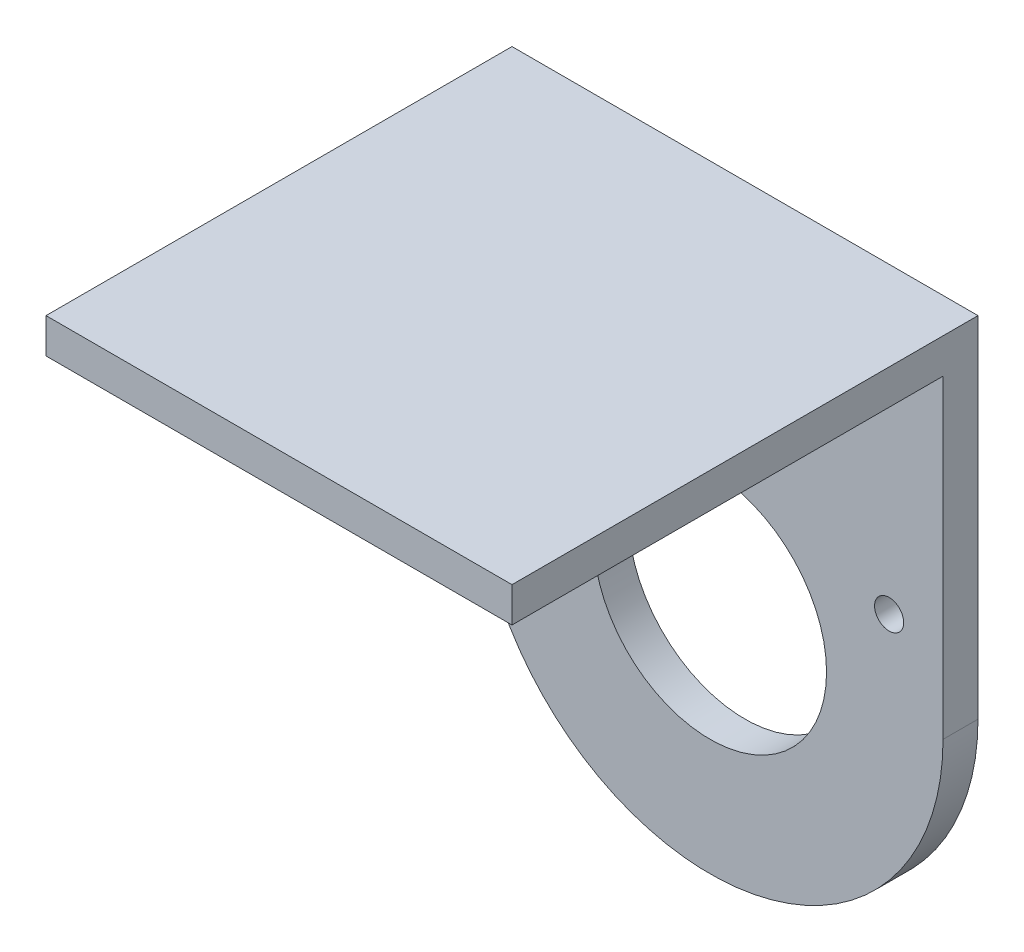
ISO-10303-21;
HEADER;
FILE_DESCRIPTION(('STEP AP214'),'2;1');
FILE_NAME('part.step','',(''),(''),'','','');
FILE_SCHEMA(('AUTOMOTIVE_DESIGN { 1 0 10303 214 1 1 1 1 }'));
ENDSEC;
DATA;
#1=APPLICATION_CONTEXT('core data for automotive mechanical design processes');
#2=APPLICATION_PROTOCOL_DEFINITION('international standard','automotive_design',2000,#1);
#3=PRODUCT_CONTEXT('',#1,'mechanical');
#4=PRODUCT('Part','Part','',(#3));
#5=PRODUCT_RELATED_PRODUCT_CATEGORY('part','',(#4));
#6=PRODUCT_DEFINITION_FORMATION('','',#4);
#7=PRODUCT_DEFINITION_CONTEXT('part definition',#1,'design');
#8=PRODUCT_DEFINITION('design','',#6,#7);
#9=PRODUCT_DEFINITION_SHAPE('','',#8);
#10=(LENGTH_UNIT() NAMED_UNIT(*) SI_UNIT(.MILLI.,.METRE.));
#11=(NAMED_UNIT(*) PLANE_ANGLE_UNIT() SI_UNIT($,.RADIAN.));
#12=(NAMED_UNIT(*) SI_UNIT($,.STERADIAN.) SOLID_ANGLE_UNIT());
#13=UNCERTAINTY_MEASURE_WITH_UNIT(LENGTH_MEASURE(1.E-05),#10,'distance_accuracy_value','');
#14=(GEOMETRIC_REPRESENTATION_CONTEXT(3) GLOBAL_UNCERTAINTY_ASSIGNED_CONTEXT((#13)) GLOBAL_UNIT_ASSIGNED_CONTEXT((#10,
#11,#12)) REPRESENTATION_CONTEXT('',''));
#15=CARTESIAN_POINT('',(0.,0.,0.));
#16=DIRECTION('',(0.,0.,1.));
#17=DIRECTION('',(1.,0.,0.));
#18=AXIS2_PLACEMENT_3D('',#15,#16,#17);
#19=CARTESIAN_POINT('',(2.4469741150185,-18.0472980486732,40.));
#20=DIRECTION('',(0.,0.,-1.));
#21=DIRECTION('',(-1.,0.,0.));
#22=AXIS2_PLACEMENT_3D('',#19,#20,#21);
#23=CYLINDRICAL_SURFACE('',#22,20.);
#24=CARTESIAN_POINT('',(2.4469741150185,-18.0472980486734,3.));
#25=DIRECTION('',(0.,0.,1.));
#26=DIRECTION('',(1.,0.,0.));
#27=AXIS2_PLACEMENT_3D('',#24,#25,#26);
#28=CIRCLE('',#27,20.);
#29=CARTESIAN_POINT('',(-17.5530258849815,-18.0472980486734,3.));
#30=VERTEX_POINT('',#29);
#31=CARTESIAN_POINT('',(22.4469741150185,-18.0472980486732,3.));
#32=VERTEX_POINT('',#31);
#33=EDGE_CURVE('E55',#30,#32,#28,.T.);
#34=ORIENTED_EDGE('',*,*,#33,.F.);
#35=DIRECTION('',(0.,0.,-1.));
#36=VECTOR('',#35,1.);
#37=CARTESIAN_POINT('',(-17.5530258849815,-18.0472980486732,40.));
#38=LINE('',#37,#36);
#39=CARTESIAN_POINT('',(-17.5530258849815,-18.0472980486732,0.));
#40=VERTEX_POINT('',#39);
#41=EDGE_CURVE('E11',#30,#40,#38,.T.);
#42=ORIENTED_EDGE('',*,*,#41,.T.);
#43=CARTESIAN_POINT('',(2.4469741150185,-18.0472980486732,0.));
#44=DIRECTION('',(0.,0.,1.));
#45=DIRECTION('',(1.,0.,0.));
#46=AXIS2_PLACEMENT_3D('',#43,#44,#45);
#47=CIRCLE('',#46,20.);
#48=CARTESIAN_POINT('',(22.4469741150185,-18.0472980486732,0.));
#49=VERTEX_POINT('',#48);
#50=EDGE_CURVE('E106',#40,#49,#47,.T.);
#51=ORIENTED_EDGE('',*,*,#50,.T.);
#52=DIRECTION('',(0.,0.,-1.));
#53=VECTOR('',#52,1.);
#54=CARTESIAN_POINT('',(22.4469741150185,-18.0472980486732,40.));
#55=LINE('',#54,#53);
#56=EDGE_CURVE('E48',#32,#49,#55,.T.);
#57=ORIENTED_EDGE('',*,*,#56,.F.);
#58=EDGE_LOOP('',(#34,#42,#51,#57));
#59=FACE_BOUND('',#58,.T.);
#60=ADVANCED_FACE('F39',(#59),#23,.T.);
#61=CARTESIAN_POINT('',(2.4469741150185,-18.0472980486732,40.));
#62=DIRECTION('',(0.,0.,-1.));
#63=DIRECTION('',(-1.,0.,0.));
#64=AXIS2_PLACEMENT_3D('',#61,#62,#63);
#65=CYLINDRICAL_SURFACE('',#64,10.);
#66=CARTESIAN_POINT('',(2.4469741150185,-18.0472980486732,0.));
#67=DIRECTION('',(0.,0.,1.));
#68=DIRECTION('',(1.,0.,0.));
#69=AXIS2_PLACEMENT_3D('',#66,#67,#68);
#70=CIRCLE('',#69,10.);
#71=CARTESIAN_POINT('',(12.4469741150185,-18.0472980486732,0.));
#72=VERTEX_POINT('',#71);
#73=EDGE_CURVE('E107',#72,#72,#70,.T.);
#74=ORIENTED_EDGE('',*,*,#73,.F.);
#75=EDGE_LOOP('',(#74));
#76=FACE_BOUND('',#75,.T.);
#77=CARTESIAN_POINT('',(2.4469741150185,-18.0472980486732,3.));
#78=DIRECTION('',(0.,0.,1.));
#79=DIRECTION('',(1.,0.,0.));
#80=AXIS2_PLACEMENT_3D('',#77,#78,#79);
#81=CIRCLE('',#80,10.);
#82=CARTESIAN_POINT('',(12.4469741150185,-18.0472980486732,3.));
#83=VERTEX_POINT('',#82);
#84=EDGE_CURVE('E43',#83,#83,#81,.T.);
#85=ORIENTED_EDGE('',*,*,#84,.T.);
#86=EDGE_LOOP('',(#85));
#87=FACE_BOUND('',#86,.T.);
#88=ADVANCED_FACE('F214',(#76,#87),#65,.F.);
#89=CARTESIAN_POINT('',(2.4469741150185,-18.0472980486732,40.));
#90=DIRECTION('',(0.,0.,1.));
#91=DIRECTION('',(1.,0.,0.));
#92=AXIS2_PLACEMENT_3D('',#89,#90,#91);
#93=PLANE('',#92);
#94=DIRECTION('',(-1.,0.,0.));
#95=VECTOR('',#94,1.);
#96=CARTESIAN_POINT('',(-17.5530258849815,8.95270195132663,40.));
#97=LINE('',#96,#95);
#98=CARTESIAN_POINT('',(22.4469741150185,8.95270195132663,40.));
#99=VERTEX_POINT('',#98);
#100=CARTESIAN_POINT('',(-17.5530258849815,8.95270195132663,40.));
#101=VERTEX_POINT('',#100);
#102=EDGE_CURVE('E139',#99,#101,#97,.T.);
#103=ORIENTED_EDGE('',*,*,#102,.F.);
#104=DIRECTION('',(0.,1.,0.));
#105=VECTOR('',#104,1.);
#106=CARTESIAN_POINT('',(22.4469741150185,11.9527019513268,40.));
#107=LINE('',#106,#105);
#108=CARTESIAN_POINT('',(22.4469741150185,11.9527019513268,40.));
#109=VERTEX_POINT('',#108);
#110=EDGE_CURVE('E148',#99,#109,#107,.T.);
#111=ORIENTED_EDGE('',*,*,#110,.T.);
#112=DIRECTION('',(-1.,0.,0.));
#113=VECTOR('',#112,1.);
#114=CARTESIAN_POINT('',(-17.5530258849815,11.9527019513268,40.));
#115=LINE('',#114,#113);
#116=CARTESIAN_POINT('',(-17.5530258849815,11.9527019513268,40.));
#117=VERTEX_POINT('',#116);
#118=EDGE_CURVE('E64',#109,#117,#115,.T.);
#119=ORIENTED_EDGE('',*,*,#118,.T.);
#120=DIRECTION('',(0.,-1.,0.));
#121=VECTOR('',#120,1.);
#122=CARTESIAN_POINT('',(-17.5530258849815,11.9527019513268,40.));
#123=LINE('',#122,#121);
#124=EDGE_CURVE('E92',#117,#101,#123,.T.);
#125=ORIENTED_EDGE('',*,*,#124,.T.);
#126=EDGE_LOOP('',(#103,#111,#119,#125));
#127=FACE_BOUND('',#126,.T.);
#128=ADVANCED_FACE('F154',(#127),#93,.T.);
#129=CARTESIAN_POINT('',(2.4469741150185,-18.0472980486732,0.));
#130=DIRECTION('',(0.,0.,1.));
#131=DIRECTION('',(1.,0.,0.));
#132=AXIS2_PLACEMENT_3D('',#129,#130,#131);
#133=PLANE('',#132);
#134=CARTESIAN_POINT('',(-13.1833837976063,-11.0613262953469,0.));
#135=DIRECTION('',(0.,0.,-1.));
#136=DIRECTION('',(-1.,0.,0.));
#137=AXIS2_PLACEMENT_3D('',#134,#135,#136);
#138=CIRCLE('',#137,1.25);
#139=CARTESIAN_POINT('',(-14.4333837976063,-11.0613262953469,0.));
#140=VERTEX_POINT('',#139);
#141=EDGE_CURVE('E176',#140,#140,#138,.T.);
#142=ORIENTED_EDGE('',*,*,#141,.F.);
#143=EDGE_LOOP('',(#142));
#144=FACE_BOUND('',#143,.T.);
#145=CARTESIAN_POINT('',(17.8166162023937,-11.0613262953471,0.));
#146=DIRECTION('',(0.,0.,-1.));
#147=DIRECTION('',(-1.,0.,0.));
#148=AXIS2_PLACEMENT_3D('',#145,#146,#147);
#149=CIRCLE('',#148,1.25);
#150=CARTESIAN_POINT('',(16.5666162023937,-11.0613262953471,0.));
#151=VERTEX_POINT('',#150);
#152=EDGE_CURVE('E170',#151,#151,#149,.T.);
#153=ORIENTED_EDGE('',*,*,#152,.F.);
#154=EDGE_LOOP('',(#153));
#155=FACE_BOUND('',#154,.T.);
#156=CARTESIAN_POINT('',(-5.4333837976061,2.36206746331189,0.));
#157=DIRECTION('',(0.,0.,-1.));
#158=DIRECTION('',(-1.,0.,0.));
#159=AXIS2_PLACEMENT_3D('',#156,#157,#158);
#160=CIRCLE('',#159,1.25);
#161=CARTESIAN_POINT('',(-6.6833837976061,2.36206746331189,0.));
#162=VERTEX_POINT('',#161);
#163=EDGE_CURVE('E164',#162,#162,#160,.T.);
#164=ORIENTED_EDGE('',*,*,#163,.F.);
#165=EDGE_LOOP('',(#164));
#166=FACE_BOUND('',#165,.T.);
#167=CARTESIAN_POINT('',(10.0666162023939,2.36206746331162,0.));
#168=DIRECTION('',(0.,0.,-1.));
#169=DIRECTION('',(-1.,0.,0.));
#170=AXIS2_PLACEMENT_3D('',#167,#168,#169);
#171=CIRCLE('',#170,1.25);
#172=CARTESIAN_POINT('',(8.81661620239393,2.36206746331162,0.));
#173=VERTEX_POINT('',#172);
#174=EDGE_CURVE('E158',#173,#173,#171,.T.);
#175=ORIENTED_EDGE('',*,*,#174,.F.);
#176=EDGE_LOOP('',(#175));
#177=FACE_BOUND('',#176,.T.);
#178=DIRECTION('',(0.,-1.,0.));
#179=VECTOR('',#178,1.);
#180=CARTESIAN_POINT('',(-17.5530258849815,11.9527019513268,0.));
#181=LINE('',#180,#179);
#182=CARTESIAN_POINT('',(-17.5530258849815,11.9527019513268,0.));
#183=VERTEX_POINT('',#182);
#184=EDGE_CURVE('E99',#183,#40,#181,.T.);
#185=ORIENTED_EDGE('',*,*,#184,.F.);
#186=DIRECTION('',(-1.,0.,0.));
#187=VECTOR('',#186,1.);
#188=CARTESIAN_POINT('',(-17.5530258849815,11.9527019513268,0.));
#189=LINE('',#188,#187);
#190=CARTESIAN_POINT('',(22.4469741150185,11.9527019513268,0.));
#191=VERTEX_POINT('',#190);
#192=EDGE_CURVE('E82',#191,#183,#189,.T.);
#193=ORIENTED_EDGE('',*,*,#192,.F.);
#194=DIRECTION('',(0.,1.,0.));
#195=VECTOR('',#194,1.);
#196=CARTESIAN_POINT('',(22.4469741150185,11.9527019513268,0.));
#197=LINE('',#196,#195);
#198=EDGE_CURVE('E93',#49,#191,#197,.T.);
#199=ORIENTED_EDGE('',*,*,#198,.F.);
#200=ORIENTED_EDGE('',*,*,#50,.F.);
#201=EDGE_LOOP('',(#185,#193,#199,#200));
#202=FACE_BOUND('',#201,.T.);
#203=ORIENTED_EDGE('',*,*,#73,.T.);
#204=EDGE_LOOP('',(#203));
#205=FACE_BOUND('',#204,.T.);
#206=ADVANCED_FACE('F103',(#144,#155,#166,#177,#202,#205),#133,.F.);
#207=CARTESIAN_POINT('',(-17.5530258849815,11.9527019513268,40.));
#208=DIRECTION('',(1.,0.,0.));
#209=DIRECTION('',(0.,1.,0.));
#210=AXIS2_PLACEMENT_3D('',#207,#208,#209);
#211=PLANE('',#210);
#212=DIRECTION('',(0.,-1.,0.));
#213=VECTOR('',#212,1.);
#214=CARTESIAN_POINT('',(-17.5530258849815,-18.0472980486734,3.));
#215=LINE('',#214,#213);
#216=CARTESIAN_POINT('',(-17.5530258849815,8.95270195132663,3.));
#217=VERTEX_POINT('',#216);
#218=EDGE_CURVE('E125',#217,#30,#215,.T.);
#219=ORIENTED_EDGE('',*,*,#218,.F.);
#220=DIRECTION('',(0.,0.,1.));
#221=VECTOR('',#220,1.);
#222=CARTESIAN_POINT('',(-17.5530258849815,8.95270195132663,3.));
#223=LINE('',#222,#221);
#224=EDGE_CURVE('E144',#217,#101,#223,.T.);
#225=ORIENTED_EDGE('',*,*,#224,.T.);
#226=ORIENTED_EDGE('',*,*,#124,.F.);
#227=DIRECTION('',(0.,0.,-1.));
#228=VECTOR('',#227,1.);
#229=CARTESIAN_POINT('',(-17.5530258849815,11.9527019513268,40.));
#230=LINE('',#229,#228);
#231=EDGE_CURVE('E85',#117,#183,#230,.T.);
#232=ORIENTED_EDGE('',*,*,#231,.T.);
#233=ORIENTED_EDGE('',*,*,#184,.T.);
#234=ORIENTED_EDGE('',*,*,#41,.F.);
#235=EDGE_LOOP('',(#219,#225,#226,#232,#233,#234));
#236=FACE_BOUND('',#235,.T.);
#237=ADVANCED_FACE('F41',(#236),#211,.F.);
#238=CARTESIAN_POINT('',(22.4469741150185,11.9527019513268,40.));
#239=DIRECTION('',(-1.,0.,0.));
#240=DIRECTION('',(0.,-1.,0.));
#241=AXIS2_PLACEMENT_3D('',#238,#239,#240);
#242=PLANE('',#241);
#243=ORIENTED_EDGE('',*,*,#110,.F.);
#244=DIRECTION('',(0.,0.,1.));
#245=VECTOR('',#244,1.);
#246=CARTESIAN_POINT('',(22.4469741150185,8.95270195132663,3.));
#247=LINE('',#246,#245);
#248=CARTESIAN_POINT('',(22.4469741150185,8.95270195132663,3.));
#249=VERTEX_POINT('',#248);
#250=EDGE_CURVE('E143',#249,#99,#247,.T.);
#251=ORIENTED_EDGE('',*,*,#250,.F.);
#252=DIRECTION('',(0.,1.,0.));
#253=VECTOR('',#252,1.);
#254=CARTESIAN_POINT('',(22.4469741150185,-18.0472980486734,3.));
#255=LINE('',#254,#253);
#256=EDGE_CURVE('E122',#32,#249,#255,.T.);
#257=ORIENTED_EDGE('',*,*,#256,.F.);
#258=ORIENTED_EDGE('',*,*,#56,.T.);
#259=ORIENTED_EDGE('',*,*,#198,.T.);
#260=DIRECTION('',(0.,0.,-1.));
#261=VECTOR('',#260,1.);
#262=CARTESIAN_POINT('',(22.4469741150185,11.9527019513268,40.));
#263=LINE('',#262,#261);
#264=EDGE_CURVE('E88',#109,#191,#263,.T.);
#265=ORIENTED_EDGE('',*,*,#264,.F.);
#266=EDGE_LOOP('',(#243,#251,#257,#258,#259,#265));
#267=FACE_BOUND('',#266,.T.);
#268=ADVANCED_FACE('F120',(#267),#242,.F.);
#269=CARTESIAN_POINT('',(-17.5530258849815,11.9527019513268,40.));
#270=DIRECTION('',(0.,-1.,0.));
#271=DIRECTION('',(0.,0.,-1.));
#272=AXIS2_PLACEMENT_3D('',#269,#270,#271);
#273=PLANE('',#272);
#274=ORIENTED_EDGE('',*,*,#192,.T.);
#275=ORIENTED_EDGE('',*,*,#231,.F.);
#276=ORIENTED_EDGE('',*,*,#118,.F.);
#277=ORIENTED_EDGE('',*,*,#264,.T.);
#278=EDGE_LOOP('',(#274,#275,#276,#277));
#279=FACE_BOUND('',#278,.T.);
#280=ADVANCED_FACE('F84',(#279),#273,.F.);
#281=CARTESIAN_POINT('',(-17.5530258849815,8.95270195132663,3.));
#282=DIRECTION('',(0.,1.,0.));
#283=DIRECTION('',(0.,0.,1.));
#284=AXIS2_PLACEMENT_3D('',#281,#282,#283);
#285=PLANE('',#284);
#286=ORIENTED_EDGE('',*,*,#102,.T.);
#287=ORIENTED_EDGE('',*,*,#224,.F.);
#288=DIRECTION('',(-1.,0.,0.));
#289=VECTOR('',#288,1.);
#290=CARTESIAN_POINT('',(-17.5530258849815,8.95270195132663,3.));
#291=LINE('',#290,#289);
#292=EDGE_CURVE('E141',#249,#217,#291,.T.);
#293=ORIENTED_EDGE('',*,*,#292,.F.);
#294=ORIENTED_EDGE('',*,*,#250,.T.);
#295=EDGE_LOOP('',(#286,#287,#293,#294));
#296=FACE_BOUND('',#295,.T.);
#297=ADVANCED_FACE('F142',(#296),#285,.F.);
#298=CARTESIAN_POINT('',(2.4469741150185,-18.0472980486734,3.));
#299=DIRECTION('',(0.,0.,1.));
#300=DIRECTION('',(1.,0.,0.));
#301=AXIS2_PLACEMENT_3D('',#298,#299,#300);
#302=PLANE('',#301);
#303=CARTESIAN_POINT('',(-13.1833837976063,-11.0613262953469,3.));
#304=DIRECTION('',(0.,0.,-1.));
#305=DIRECTION('',(-1.,0.,0.));
#306=AXIS2_PLACEMENT_3D('',#303,#304,#305);
#307=CIRCLE('',#306,1.25);
#308=CARTESIAN_POINT('',(-14.4333837976063,-11.0613262953469,3.));
#309=VERTEX_POINT('',#308);
#310=EDGE_CURVE('E173',#309,#309,#307,.T.);
#311=ORIENTED_EDGE('',*,*,#310,.T.);
#312=EDGE_LOOP('',(#311));
#313=FACE_BOUND('',#312,.T.);
#314=CARTESIAN_POINT('',(17.8166162023937,-11.0613262953471,3.));
#315=DIRECTION('',(0.,0.,-1.));
#316=DIRECTION('',(-1.,0.,0.));
#317=AXIS2_PLACEMENT_3D('',#314,#315,#316);
#318=CIRCLE('',#317,1.25);
#319=CARTESIAN_POINT('',(16.5666162023937,-11.0613262953471,3.));
#320=VERTEX_POINT('',#319);
#321=EDGE_CURVE('E167',#320,#320,#318,.T.);
#322=ORIENTED_EDGE('',*,*,#321,.T.);
#323=EDGE_LOOP('',(#322));
#324=FACE_BOUND('',#323,.T.);
#325=CARTESIAN_POINT('',(-5.4333837976061,2.36206746331189,3.));
#326=DIRECTION('',(0.,0.,-1.));
#327=DIRECTION('',(-1.,0.,0.));
#328=AXIS2_PLACEMENT_3D('',#325,#326,#327);
#329=CIRCLE('',#328,1.25);
#330=CARTESIAN_POINT('',(-6.6833837976061,2.36206746331189,3.));
#331=VERTEX_POINT('',#330);
#332=EDGE_CURVE('E162',#331,#331,#329,.T.);
#333=ORIENTED_EDGE('',*,*,#332,.T.);
#334=EDGE_LOOP('',(#333));
#335=FACE_BOUND('',#334,.T.);
#336=CARTESIAN_POINT('',(10.0666162023939,2.36206746331162,3.));
#337=DIRECTION('',(0.,0.,-1.));
#338=DIRECTION('',(-1.,0.,0.));
#339=AXIS2_PLACEMENT_3D('',#336,#337,#338);
#340=CIRCLE('',#339,1.25);
#341=CARTESIAN_POINT('',(8.81661620239393,2.36206746331162,3.));
#342=VERTEX_POINT('',#341);
#343=EDGE_CURVE('E155',#342,#342,#340,.T.);
#344=ORIENTED_EDGE('',*,*,#343,.T.);
#345=EDGE_LOOP('',(#344));
#346=FACE_BOUND('',#345,.T.);
#347=ORIENTED_EDGE('',*,*,#84,.F.);
#348=EDGE_LOOP('',(#347));
#349=FACE_BOUND('',#348,.T.);
#350=ORIENTED_EDGE('',*,*,#33,.T.);
#351=ORIENTED_EDGE('',*,*,#256,.T.);
#352=ORIENTED_EDGE('',*,*,#292,.T.);
#353=ORIENTED_EDGE('',*,*,#218,.T.);
#354=EDGE_LOOP('',(#350,#351,#352,#353));
#355=FACE_BOUND('',#354,.T.);
#356=ADVANCED_FACE('F146',(#313,#324,#335,#346,#349,#355),#302,.T.);
#357=CARTESIAN_POINT('',(10.0666162023939,2.36206746331162,3.));
#358=DIRECTION('',(0.,0.,-1.));
#359=DIRECTION('',(-1.,0.,0.));
#360=AXIS2_PLACEMENT_3D('',#357,#358,#359);
#361=CYLINDRICAL_SURFACE('',#360,1.25);
#362=ORIENTED_EDGE('',*,*,#343,.F.);
#363=EDGE_LOOP('',(#362));
#364=FACE_BOUND('',#363,.T.);
#365=ORIENTED_EDGE('',*,*,#174,.T.);
#366=EDGE_LOOP('',(#365));
#367=FACE_BOUND('',#366,.T.);
#368=ADVANCED_FACE('F200',(#364,#367),#361,.F.);
#369=CARTESIAN_POINT('',(-5.4333837976061,2.36206746331189,3.));
#370=DIRECTION('',(0.,0.,-1.));
#371=DIRECTION('',(-1.,0.,0.));
#372=AXIS2_PLACEMENT_3D('',#369,#370,#371);
#373=CYLINDRICAL_SURFACE('',#372,1.25);
#374=ORIENTED_EDGE('',*,*,#332,.F.);
#375=EDGE_LOOP('',(#374));
#376=FACE_BOUND('',#375,.T.);
#377=ORIENTED_EDGE('',*,*,#163,.T.);
#378=EDGE_LOOP('',(#377));
#379=FACE_BOUND('',#378,.T.);
#380=ADVANCED_FACE('F202',(#376,#379),#373,.F.);
#381=CARTESIAN_POINT('',(17.8166162023937,-11.0613262953471,3.));
#382=DIRECTION('',(0.,0.,-1.));
#383=DIRECTION('',(-1.,0.,0.));
#384=AXIS2_PLACEMENT_3D('',#381,#382,#383);
#385=CYLINDRICAL_SURFACE('',#384,1.25);
#386=ORIENTED_EDGE('',*,*,#321,.F.);
#387=EDGE_LOOP('',(#386));
#388=FACE_BOUND('',#387,.T.);
#389=ORIENTED_EDGE('',*,*,#152,.T.);
#390=EDGE_LOOP('',(#389));
#391=FACE_BOUND('',#390,.T.);
#392=ADVANCED_FACE('F187',(#388,#391),#385,.F.);
#393=CARTESIAN_POINT('',(-13.1833837976063,-11.0613262953469,3.));
#394=DIRECTION('',(0.,0.,-1.));
#395=DIRECTION('',(-1.,0.,0.));
#396=AXIS2_PLACEMENT_3D('',#393,#394,#395);
#397=CYLINDRICAL_SURFACE('',#396,1.25);
#398=ORIENTED_EDGE('',*,*,#310,.F.);
#399=EDGE_LOOP('',(#398));
#400=FACE_BOUND('',#399,.T.);
#401=ORIENTED_EDGE('',*,*,#141,.T.);
#402=EDGE_LOOP('',(#401));
#403=FACE_BOUND('',#402,.T.);
#404=ADVANCED_FACE('F184',(#400,#403),#397,.F.);
#405=CLOSED_SHELL('',(#60,#88,#128,#206,#237,#268,#280,#297,#356,#368,#380,#392,#404));
#406=MANIFOLD_SOLID_BREP('B2',#405);
#407=ADVANCED_BREP_SHAPE_REPRESENTATION('',(#18,#406),#14);
#408=SHAPE_DEFINITION_REPRESENTATION(#9,#407);
ENDSEC;
END-ISO-10303-21;
